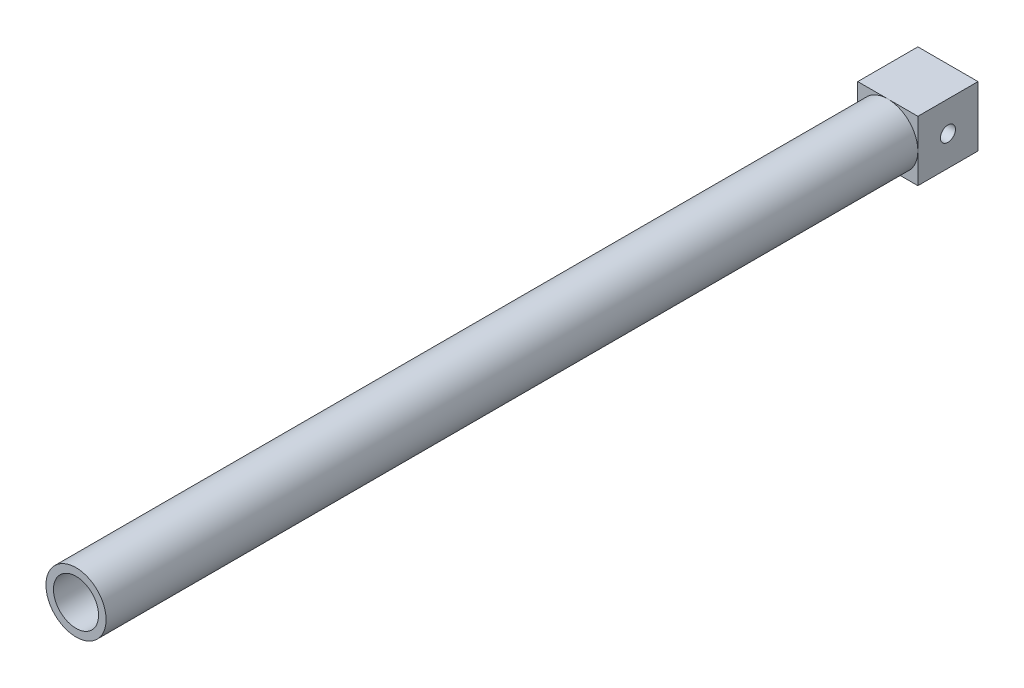
ISO-10303-21;
HEADER;
FILE_DESCRIPTION(('STEP AP214'),'2;1');
FILE_NAME('part.step','',(''),(''),'','','');
FILE_SCHEMA(('AUTOMOTIVE_DESIGN { 1 0 10303 214 1 1 1 1 }'));
ENDSEC;
DATA;
#1=APPLICATION_CONTEXT('core data for automotive mechanical design processes');
#2=APPLICATION_PROTOCOL_DEFINITION('international standard','automotive_design',2000,#1);
#3=PRODUCT_CONTEXT('',#1,'mechanical');
#4=PRODUCT('Part','Part','',(#3));
#5=PRODUCT_RELATED_PRODUCT_CATEGORY('part','',(#4));
#6=PRODUCT_DEFINITION_FORMATION('','',#4);
#7=PRODUCT_DEFINITION_CONTEXT('part definition',#1,'design');
#8=PRODUCT_DEFINITION('design','',#6,#7);
#9=PRODUCT_DEFINITION_SHAPE('','',#8);
#10=(LENGTH_UNIT() NAMED_UNIT(*) SI_UNIT(.MILLI.,.METRE.));
#11=(NAMED_UNIT(*) PLANE_ANGLE_UNIT() SI_UNIT($,.RADIAN.));
#12=(NAMED_UNIT(*) SI_UNIT($,.STERADIAN.) SOLID_ANGLE_UNIT());
#13=UNCERTAINTY_MEASURE_WITH_UNIT(LENGTH_MEASURE(1.E-05),#10,'distance_accuracy_value','');
#14=(GEOMETRIC_REPRESENTATION_CONTEXT(3) GLOBAL_UNCERTAINTY_ASSIGNED_CONTEXT((#13)) GLOBAL_UNIT_ASSIGNED_CONTEXT((#10,
#11,#12)) REPRESENTATION_CONTEXT('',''));
#15=CARTESIAN_POINT('',(0.,0.,0.));
#16=DIRECTION('',(0.,0.,1.));
#17=DIRECTION('',(1.,0.,0.));
#18=AXIS2_PLACEMENT_3D('',#15,#16,#17);
#19=CARTESIAN_POINT('',(0.,0.,-10.));
#20=DIRECTION('',(0.,0.,1.));
#21=DIRECTION('',(1.,0.,0.));
#22=AXIS2_PLACEMENT_3D('',#19,#20,#21);
#23=CYLINDRICAL_SURFACE('',#22,10.);
#24=CARTESIAN_POINT('',(0.,0.,10.));
#25=DIRECTION('',(0.,0.,1.));
#26=DIRECTION('',(1.,0.,0.));
#27=AXIS2_PLACEMENT_3D('',#24,#25,#26);
#28=CIRCLE('',#27,10.);
#29=CARTESIAN_POINT('',(10.,0.,10.));
#30=VERTEX_POINT('',#29);
#31=CARTESIAN_POINT('',(0.,-10.,10.));
#32=VERTEX_POINT('',#31);
#33=EDGE_CURVE('E136',#30,#32,#28,.F.);
#34=ORIENTED_EDGE('',*,*,#33,.F.);
#35=CARTESIAN_POINT('',(0.,10.,10.));
#36=VERTEX_POINT('',#35);
#37=EDGE_CURVE('E129',#36,#30,#28,.F.);
#38=ORIENTED_EDGE('',*,*,#37,.F.);
#39=CARTESIAN_POINT('',(-10.,0.,10.));
#40=VERTEX_POINT('',#39);
#41=EDGE_CURVE('E52',#40,#36,#28,.F.);
#42=ORIENTED_EDGE('',*,*,#41,.F.);
#43=EDGE_CURVE('E47',#32,#40,#28,.F.);
#44=ORIENTED_EDGE('',*,*,#43,.F.);
#45=EDGE_LOOP('',(#34,#38,#42,#44));
#46=FACE_BOUND('',#45,.T.);
#47=CARTESIAN_POINT('',(0.,0.,280.));
#48=DIRECTION('',(0.,0.,1.));
#49=DIRECTION('',(1.,0.,0.));
#50=AXIS2_PLACEMENT_3D('',#47,#48,#49);
#51=CIRCLE('',#50,10.);
#52=CARTESIAN_POINT('',(10.,0.,280.));
#53=VERTEX_POINT('',#52);
#54=EDGE_CURVE('E40',#53,#53,#51,.T.);
#55=ORIENTED_EDGE('',*,*,#54,.F.);
#56=EDGE_LOOP('',(#55));
#57=FACE_BOUND('',#56,.T.);
#58=ADVANCED_FACE('F33',(#46,#57),#23,.T.);
#59=CARTESIAN_POINT('',(0.,0.,280.));
#60=DIRECTION('',(0.,0.,1.));
#61=DIRECTION('',(1.,0.,0.));
#62=AXIS2_PLACEMENT_3D('',#59,#60,#61);
#63=PLANE('',#62);
#64=CARTESIAN_POINT('',(0.,0.,280.));
#65=DIRECTION('',(0.,0.,1.));
#66=DIRECTION('',(1.,0.,0.));
#67=AXIS2_PLACEMENT_3D('',#64,#65,#66);
#68=CIRCLE('',#67,7.5);
#69=CARTESIAN_POINT('',(7.5,0.,280.));
#70=VERTEX_POINT('',#69);
#71=EDGE_CURVE('E137',#70,#70,#68,.T.);
#72=ORIENTED_EDGE('',*,*,#71,.F.);
#73=EDGE_LOOP('',(#72));
#74=FACE_BOUND('',#73,.T.);
#75=ORIENTED_EDGE('',*,*,#54,.T.);
#76=EDGE_LOOP('',(#75));
#77=FACE_BOUND('',#76,.T.);
#78=ADVANCED_FACE('F142',(#74,#77),#63,.T.);
#79=CARTESIAN_POINT('',(0.,0.,280.));
#80=DIRECTION('',(0.,0.,-1.));
#81=DIRECTION('',(-1.,0.,0.));
#82=AXIS2_PLACEMENT_3D('',#79,#80,#81);
#83=CYLINDRICAL_SURFACE('',#82,7.5);
#84=CARTESIAN_POINT('',(0.,0.,10.));
#85=DIRECTION('',(0.,0.,1.));
#86=DIRECTION('',(1.,0.,0.));
#87=AXIS2_PLACEMENT_3D('',#84,#85,#86);
#88=CIRCLE('',#87,7.5);
#89=CARTESIAN_POINT('',(7.5,0.,10.));
#90=VERTEX_POINT('',#89);
#91=EDGE_CURVE('E11',#90,#90,#88,.T.);
#92=ORIENTED_EDGE('',*,*,#91,.F.);
#93=EDGE_LOOP('',(#92));
#94=FACE_BOUND('',#93,.T.);
#95=ORIENTED_EDGE('',*,*,#71,.T.);
#96=EDGE_LOOP('',(#95));
#97=FACE_BOUND('',#96,.T.);
#98=ADVANCED_FACE('F148',(#94,#97),#83,.F.);
#99=CARTESIAN_POINT('',(0.,0.,10.));
#100=DIRECTION('',(0.,0.,1.));
#101=DIRECTION('',(1.,0.,0.));
#102=AXIS2_PLACEMENT_3D('',#99,#100,#101);
#103=PLANE('',#102);
#104=ORIENTED_EDGE('',*,*,#91,.T.);
#105=EDGE_LOOP('',(#104));
#106=FACE_BOUND('',#105,.T.);
#107=ADVANCED_FACE('F177',(#106),#103,.T.);
#108=CARTESIAN_POINT('',(-10.,-10.,-10.));
#109=DIRECTION('',(-1.,0.,0.));
#110=DIRECTION('',(0.,0.,1.));
#111=AXIS2_PLACEMENT_3D('',#108,#109,#110);
#112=PLANE('',#111);
#113=CARTESIAN_POINT('',(-10.,0.,0.));
#114=DIRECTION('',(1.,0.,0.));
#115=DIRECTION('',(0.,0.,-1.));
#116=AXIS2_PLACEMENT_3D('',#113,#114,#115);
#117=CIRCLE('',#116,2.5);
#118=CARTESIAN_POINT('',(-10.,0.,-2.5));
#119=VERTEX_POINT('',#118);
#120=EDGE_CURVE('E206',#119,#119,#117,.T.);
#121=ORIENTED_EDGE('',*,*,#120,.T.);
#122=EDGE_LOOP('',(#121));
#123=FACE_BOUND('',#122,.T.);
#124=DIRECTION('',(0.,-1.,0.));
#125=VECTOR('',#124,1.);
#126=CARTESIAN_POINT('',(-10.,-10.,-10.));
#127=LINE('',#126,#125);
#128=CARTESIAN_POINT('',(-10.,10.,-10.));
#129=VERTEX_POINT('',#128);
#130=CARTESIAN_POINT('',(-10.,-10.,-10.));
#131=VERTEX_POINT('',#130);
#132=EDGE_CURVE('E99',#129,#131,#127,.T.);
#133=ORIENTED_EDGE('',*,*,#132,.T.);
#134=DIRECTION('',(0.,0.,1.));
#135=VECTOR('',#134,1.);
#136=CARTESIAN_POINT('',(-10.,-10.,-10.));
#137=LINE('',#136,#135);
#138=CARTESIAN_POINT('',(-10.,-10.,10.));
#139=VERTEX_POINT('',#138);
#140=EDGE_CURVE('E95',#131,#139,#137,.T.);
#141=ORIENTED_EDGE('',*,*,#140,.T.);
#142=DIRECTION('',(0.,-1.,0.));
#143=VECTOR('',#142,1.);
#144=CARTESIAN_POINT('',(-10.,-10.,10.));
#145=LINE('',#144,#143);
#146=EDGE_CURVE('E83',#40,#139,#145,.T.);
#147=ORIENTED_EDGE('',*,*,#146,.F.);
#148=CARTESIAN_POINT('',(-10.,10.,10.));
#149=VERTEX_POINT('',#148);
#150=EDGE_CURVE('E91',#149,#40,#145,.T.);
#151=ORIENTED_EDGE('',*,*,#150,.F.);
#152=DIRECTION('',(0.,0.,1.));
#153=VECTOR('',#152,1.);
#154=CARTESIAN_POINT('',(-10.,10.,-10.));
#155=LINE('',#154,#153);
#156=EDGE_CURVE('E126',#129,#149,#155,.T.);
#157=ORIENTED_EDGE('',*,*,#156,.F.);
#158=EDGE_LOOP('',(#133,#141,#147,#151,#157));
#159=FACE_BOUND('',#158,.T.);
#160=ADVANCED_FACE('F96',(#123,#159),#112,.T.);
#161=CARTESIAN_POINT('',(10.,10.,-10.));
#162=DIRECTION('',(0.,1.,0.));
#163=DIRECTION('',(-1.,0.,0.));
#164=AXIS2_PLACEMENT_3D('',#161,#162,#163);
#165=PLANE('',#164);
#166=DIRECTION('',(-1.,0.,0.));
#167=VECTOR('',#166,1.);
#168=CARTESIAN_POINT('',(10.,10.,-10.));
#169=LINE('',#168,#167);
#170=CARTESIAN_POINT('',(10.,10.,-10.));
#171=VERTEX_POINT('',#170);
#172=EDGE_CURVE('E103',#171,#129,#169,.T.);
#173=ORIENTED_EDGE('',*,*,#172,.T.);
#174=ORIENTED_EDGE('',*,*,#156,.T.);
#175=DIRECTION('',(-1.,0.,0.));
#176=VECTOR('',#175,1.);
#177=CARTESIAN_POINT('',(10.,10.,10.));
#178=LINE('',#177,#176);
#179=EDGE_CURVE('E116',#36,#149,#178,.T.);
#180=ORIENTED_EDGE('',*,*,#179,.F.);
#181=CARTESIAN_POINT('',(10.,10.,10.));
#182=VERTEX_POINT('',#181);
#183=EDGE_CURVE('E117',#182,#36,#178,.T.);
#184=ORIENTED_EDGE('',*,*,#183,.F.);
#185=DIRECTION('',(0.,0.,1.));
#186=VECTOR('',#185,1.);
#187=CARTESIAN_POINT('',(10.,10.,-10.));
#188=LINE('',#187,#186);
#189=EDGE_CURVE('E130',#171,#182,#188,.T.);
#190=ORIENTED_EDGE('',*,*,#189,.F.);
#191=EDGE_LOOP('',(#173,#174,#180,#184,#190));
#192=FACE_BOUND('',#191,.T.);
#193=ADVANCED_FACE('F167',(#192),#165,.T.);
#194=CARTESIAN_POINT('',(10.,-10.,-10.));
#195=DIRECTION('',(1.,0.,0.));
#196=DIRECTION('',(0.,0.,-1.));
#197=AXIS2_PLACEMENT_3D('',#194,#195,#196);
#198=PLANE('',#197);
#199=CARTESIAN_POINT('',(10.,0.,0.));
#200=DIRECTION('',(1.,0.,0.));
#201=DIRECTION('',(0.,0.,-1.));
#202=AXIS2_PLACEMENT_3D('',#199,#200,#201);
#203=CIRCLE('',#202,2.5);
#204=CARTESIAN_POINT('',(10.,0.,-2.5));
#205=VERTEX_POINT('',#204);
#206=EDGE_CURVE('E92',#205,#205,#203,.T.);
#207=ORIENTED_EDGE('',*,*,#206,.F.);
#208=EDGE_LOOP('',(#207));
#209=FACE_BOUND('',#208,.T.);
#210=DIRECTION('',(0.,1.,0.));
#211=VECTOR('',#210,1.);
#212=CARTESIAN_POINT('',(10.,-10.,-10.));
#213=LINE('',#212,#211);
#214=CARTESIAN_POINT('',(10.,-10.,-10.));
#215=VERTEX_POINT('',#214);
#216=EDGE_CURVE('E123',#215,#171,#213,.T.);
#217=ORIENTED_EDGE('',*,*,#216,.T.);
#218=ORIENTED_EDGE('',*,*,#189,.T.);
#219=DIRECTION('',(0.,1.,0.));
#220=VECTOR('',#219,1.);
#221=CARTESIAN_POINT('',(10.,-10.,10.));
#222=LINE('',#221,#220);
#223=EDGE_CURVE('E109',#30,#182,#222,.T.);
#224=ORIENTED_EDGE('',*,*,#223,.F.);
#225=CARTESIAN_POINT('',(10.,-10.,10.));
#226=VERTEX_POINT('',#225);
#227=EDGE_CURVE('E111',#226,#30,#222,.T.);
#228=ORIENTED_EDGE('',*,*,#227,.F.);
#229=DIRECTION('',(0.,0.,1.));
#230=VECTOR('',#229,1.);
#231=CARTESIAN_POINT('',(10.,-10.,-10.));
#232=LINE('',#231,#230);
#233=EDGE_CURVE('E102',#215,#226,#232,.T.);
#234=ORIENTED_EDGE('',*,*,#233,.F.);
#235=EDGE_LOOP('',(#217,#218,#224,#228,#234));
#236=FACE_BOUND('',#235,.T.);
#237=ADVANCED_FACE('F158',(#209,#236),#198,.T.);
#238=CARTESIAN_POINT('',(10.,-10.,-10.));
#239=DIRECTION('',(0.,-1.,0.));
#240=DIRECTION('',(0.,0.,-1.));
#241=AXIS2_PLACEMENT_3D('',#238,#239,#240);
#242=PLANE('',#241);
#243=DIRECTION('',(1.,0.,0.));
#244=VECTOR('',#243,1.);
#245=CARTESIAN_POINT('',(10.,-10.,-10.));
#246=LINE('',#245,#244);
#247=EDGE_CURVE('E121',#131,#215,#246,.T.);
#248=ORIENTED_EDGE('',*,*,#247,.T.);
#249=ORIENTED_EDGE('',*,*,#233,.T.);
#250=DIRECTION('',(1.,0.,0.));
#251=VECTOR('',#250,1.);
#252=CARTESIAN_POINT('',(10.,-10.,10.));
#253=LINE('',#252,#251);
#254=EDGE_CURVE('E108',#32,#226,#253,.T.);
#255=ORIENTED_EDGE('',*,*,#254,.F.);
#256=EDGE_CURVE('E87',#139,#32,#253,.T.);
#257=ORIENTED_EDGE('',*,*,#256,.F.);
#258=ORIENTED_EDGE('',*,*,#140,.F.);
#259=EDGE_LOOP('',(#248,#249,#255,#257,#258));
#260=FACE_BOUND('',#259,.T.);
#261=ADVANCED_FACE('F106',(#260),#242,.T.);
#262=ORIENTED_EDGE('',*,*,#227,.T.);
#263=ORIENTED_EDGE('',*,*,#33,.T.);
#264=ORIENTED_EDGE('',*,*,#254,.T.);
#265=EDGE_LOOP('',(#262,#263,#264));
#266=FACE_BOUND('',#265,.T.);
#267=ADVANCED_FACE('F161',(#266),#103,.T.);
#268=ORIENTED_EDGE('',*,*,#256,.T.);
#269=ORIENTED_EDGE('',*,*,#43,.T.);
#270=ORIENTED_EDGE('',*,*,#146,.T.);
#271=EDGE_LOOP('',(#268,#269,#270));
#272=FACE_BOUND('',#271,.T.);
#273=ADVANCED_FACE('F85',(#272),#103,.T.);
#274=ORIENTED_EDGE('',*,*,#150,.T.);
#275=ORIENTED_EDGE('',*,*,#41,.T.);
#276=ORIENTED_EDGE('',*,*,#179,.T.);
#277=EDGE_LOOP('',(#274,#275,#276));
#278=FACE_BOUND('',#277,.T.);
#279=ADVANCED_FACE('F170',(#278),#103,.T.);
#280=ORIENTED_EDGE('',*,*,#183,.T.);
#281=ORIENTED_EDGE('',*,*,#37,.T.);
#282=ORIENTED_EDGE('',*,*,#223,.T.);
#283=EDGE_LOOP('',(#280,#281,#282));
#284=FACE_BOUND('',#283,.T.);
#285=ADVANCED_FACE('F154',(#284),#103,.T.);
#286=CARTESIAN_POINT('',(0.,0.,-10.));
#287=DIRECTION('',(0.,0.,1.));
#288=DIRECTION('',(1.,0.,0.));
#289=AXIS2_PLACEMENT_3D('',#286,#287,#288);
#290=PLANE('',#289);
#291=ORIENTED_EDGE('',*,*,#172,.F.);
#292=ORIENTED_EDGE('',*,*,#216,.F.);
#293=ORIENTED_EDGE('',*,*,#247,.F.);
#294=ORIENTED_EDGE('',*,*,#132,.F.);
#295=EDGE_LOOP('',(#291,#292,#293,#294));
#296=FACE_BOUND('',#295,.T.);
#297=ADVANCED_FACE('F165',(#296),#290,.F.);
#298=CARTESIAN_POINT('',(10.,0.,0.));
#299=DIRECTION('',(-1.,0.,0.));
#300=DIRECTION('',(0.,0.,1.));
#301=AXIS2_PLACEMENT_3D('',#298,#299,#300);
#302=CYLINDRICAL_SURFACE('',#301,2.5);
#303=ORIENTED_EDGE('',*,*,#206,.T.);
#304=EDGE_LOOP('',(#303));
#305=FACE_BOUND('',#304,.T.);
#306=ORIENTED_EDGE('',*,*,#120,.F.);
#307=EDGE_LOOP('',(#306));
#308=FACE_BOUND('',#307,.T.);
#309=ADVANCED_FACE('F181',(#305,#308),#302,.F.);
#310=CLOSED_SHELL('',(#58,#78,#98,#107,#160,#193,#237,#261,#267,#273,#279,#285,#297,#309));
#311=MANIFOLD_SOLID_BREP('B2',#310);
#312=ADVANCED_BREP_SHAPE_REPRESENTATION('',(#18,#311),#14);
#313=SHAPE_DEFINITION_REPRESENTATION(#9,#312);
ENDSEC;
END-ISO-10303-21;
